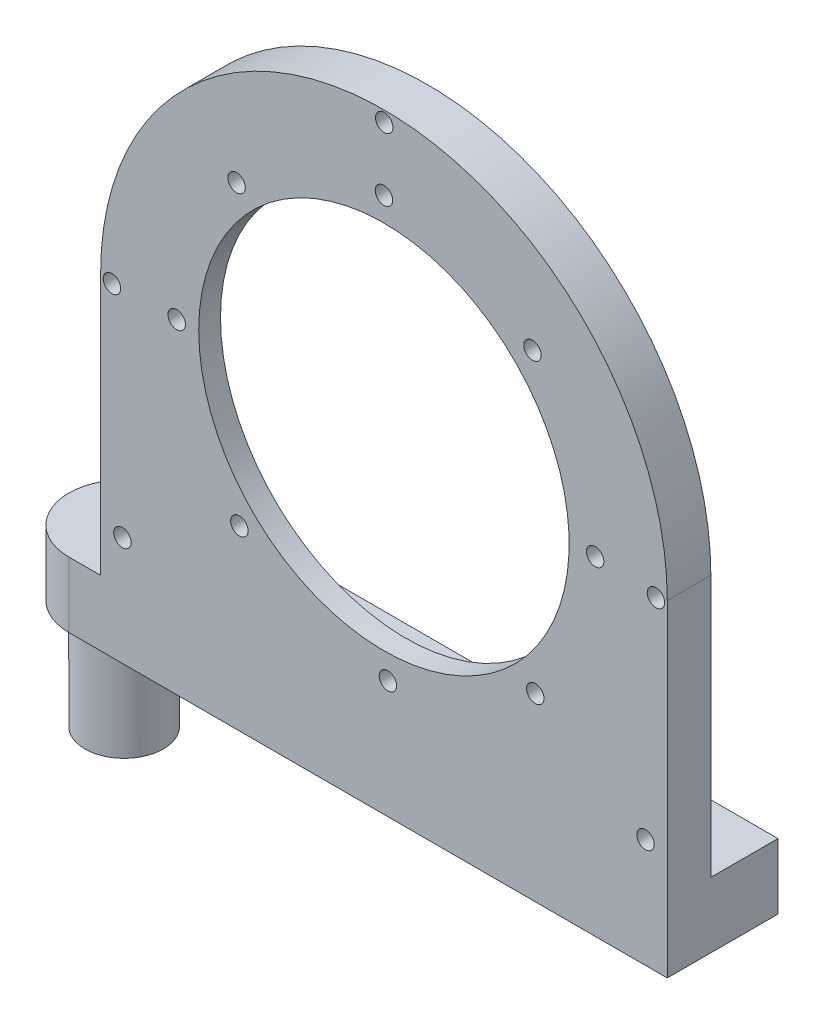
ISO-10303-21;
HEADER;
FILE_DESCRIPTION(('STEP AP214'),'2;1');
FILE_NAME('part.step','',(''),(''),'','','');
FILE_SCHEMA(('AUTOMOTIVE_DESIGN { 1 0 10303 214 1 1 1 1 }'));
ENDSEC;
DATA;
#1=APPLICATION_CONTEXT('core data for automotive mechanical design processes');
#2=APPLICATION_PROTOCOL_DEFINITION('international standard','automotive_design',2000,#1);
#3=PRODUCT_CONTEXT('',#1,'mechanical');
#4=PRODUCT('Part','Part','',(#3));
#5=PRODUCT_RELATED_PRODUCT_CATEGORY('part','',(#4));
#6=PRODUCT_DEFINITION_FORMATION('','',#4);
#7=PRODUCT_DEFINITION_CONTEXT('part definition',#1,'design');
#8=PRODUCT_DEFINITION('design','',#6,#7);
#9=PRODUCT_DEFINITION_SHAPE('','',#8);
#10=(LENGTH_UNIT() NAMED_UNIT(*) SI_UNIT(.MILLI.,.METRE.));
#11=(NAMED_UNIT(*) PLANE_ANGLE_UNIT() SI_UNIT($,.RADIAN.));
#12=(NAMED_UNIT(*) SI_UNIT($,.STERADIAN.) SOLID_ANGLE_UNIT());
#13=UNCERTAINTY_MEASURE_WITH_UNIT(LENGTH_MEASURE(1.E-05),#10,'distance_accuracy_value','');
#14=(GEOMETRIC_REPRESENTATION_CONTEXT(3) GLOBAL_UNCERTAINTY_ASSIGNED_CONTEXT((#13)) GLOBAL_UNIT_ASSIGNED_CONTEXT((#10,
#11,#12)) REPRESENTATION_CONTEXT('',''));
#15=CARTESIAN_POINT('',(0.,0.,0.));
#16=DIRECTION('',(0.,0.,1.));
#17=DIRECTION('',(1.,0.,0.));
#18=AXIS2_PLACEMENT_3D('',#15,#16,#17);
#19=CARTESIAN_POINT('',(-35.455305466238,140.,-17.2327974276527));
#20=DIRECTION('',(1.,0.,0.));
#21=DIRECTION('',(0.,0.,-1.));
#22=AXIS2_PLACEMENT_3D('',#19,#20,#21);
#23=PLANE('',#22);
#24=DIRECTION('',(0.,1.,0.));
#25=VECTOR('',#24,1.);
#26=CARTESIAN_POINT('',(-35.455305466238,15.,-1.83279742765273));
#27=LINE('',#26,#25);
#28=CARTESIAN_POINT('',(-35.455305466238,15.,-1.83279742765273));
#29=VERTEX_POINT('',#28);
#30=CARTESIAN_POINT('',(-35.455305466238,75.,-1.83279742765274));
#31=VERTEX_POINT('',#30);
#32=EDGE_CURVE('E82',#29,#31,#27,.T.);
#33=ORIENTED_EDGE('',*,*,#32,.F.);
#34=DIRECTION('',(0.,0.,1.));
#35=VECTOR('',#34,1.);
#36=CARTESIAN_POINT('',(-35.455305466238,15.,-17.2327974276527));
#37=LINE('',#36,#35);
#38=CARTESIAN_POINT('',(-35.455305466238,15.,8.16720257234727));
#39=VERTEX_POINT('',#38);
#40=EDGE_CURVE('E150',#29,#39,#37,.T.);
#41=ORIENTED_EDGE('',*,*,#40,.T.);
#42=DIRECTION('',(0.,-1.,0.));
#43=VECTOR('',#42,1.);
#44=CARTESIAN_POINT('',(-35.455305466238,140.,8.16720257234727));
#45=LINE('',#44,#43);
#46=CARTESIAN_POINT('',(-35.455305466238,75.,8.16720257234726));
#47=VERTEX_POINT('',#46);
#48=EDGE_CURVE('E157',#47,#39,#45,.T.);
#49=ORIENTED_EDGE('',*,*,#48,.F.);
#50=DIRECTION('',(0.,0.,-1.));
#51=VECTOR('',#50,1.);
#52=CARTESIAN_POINT('',(-35.455305466238,75.,132.767202572347));
#53=LINE('',#52,#51);
#54=EDGE_CURVE('E146',#47,#31,#53,.T.);
#55=ORIENTED_EDGE('',*,*,#54,.T.);
#56=EDGE_LOOP('',(#33,#41,#49,#55));
#57=FACE_BOUND('',#56,.T.);
#58=ADVANCED_FACE('F61',(#57),#23,.F.);
#59=CARTESIAN_POINT('',(29.544694533762,75.,132.767202572347));
#60=DIRECTION('',(0.,0.,-1.));
#61=DIRECTION('',(-1.,0.,0.));
#62=AXIS2_PLACEMENT_3D('',#59,#60,#61);
#63=CYLINDRICAL_SURFACE('',#62,65.);
#64=DIRECTION('',(0.,0.,-1.));
#65=VECTOR('',#64,1.);
#66=CARTESIAN_POINT('',(94.544694533762,75.,132.767202572347));
#67=LINE('',#66,#65);
#68=CARTESIAN_POINT('',(94.544694533762,75.,8.16720257234726));
#69=VERTEX_POINT('',#68);
#70=CARTESIAN_POINT('',(94.544694533762,74.9999999999996,-1.83279742765273));
#71=VERTEX_POINT('',#70);
#72=EDGE_CURVE('E136',#69,#71,#67,.T.);
#73=ORIENTED_EDGE('',*,*,#72,.T.);
#74=CARTESIAN_POINT('',(29.544694533762,75.,-1.83279742765273));
#75=DIRECTION('',(0.,0.,-1.));
#76=DIRECTION('',(-1.,0.,0.));
#77=AXIS2_PLACEMENT_3D('',#74,#75,#76);
#78=CIRCLE('',#77,65.);
#79=EDGE_CURVE('E120',#31,#71,#78,.T.);
#80=ORIENTED_EDGE('',*,*,#79,.F.);
#81=ORIENTED_EDGE('',*,*,#54,.F.);
#82=CARTESIAN_POINT('',(29.544694533762,75.,8.16720257234726));
#83=DIRECTION('',(0.,0.,-1.));
#84=DIRECTION('',(-1.,0.,0.));
#85=AXIS2_PLACEMENT_3D('',#82,#83,#84);
#86=CIRCLE('',#85,65.);
#87=EDGE_CURVE('E144',#47,#69,#86,.T.);
#88=ORIENTED_EDGE('',*,*,#87,.T.);
#89=EDGE_LOOP('',(#73,#80,#81,#88));
#90=FACE_BOUND('',#89,.T.);
#91=ADVANCED_FACE('F143',(#90),#63,.T.);
#92=CARTESIAN_POINT('',(-42.7553054662379,15.,-17.2327974276527));
#93=DIRECTION('',(0.,0.,1.));
#94=DIRECTION('',(1.,0.,0.));
#95=AXIS2_PLACEMENT_3D('',#92,#93,#94);
#96=PLANE('',#95);
#97=DIRECTION('',(-1.,0.,0.));
#98=VECTOR('',#97,1.);
#99=CARTESIAN_POINT('',(-42.7553054662379,15.,-17.2327974276527));
#100=LINE('',#99,#98);
#101=CARTESIAN_POINT('',(94.544694533762,15.,-17.2327974276527));
#102=VERTEX_POINT('',#101);
#103=CARTESIAN_POINT('',(-42.7553054662379,15.,-17.2327974276527));
#104=VERTEX_POINT('',#103);
#105=EDGE_CURVE('E166',#102,#104,#100,.T.);
#106=ORIENTED_EDGE('',*,*,#105,.F.);
#107=DIRECTION('',(0.,-1.,0.));
#108=VECTOR('',#107,1.);
#109=CARTESIAN_POINT('',(94.544694533762,15.,-17.2327974276527));
#110=LINE('',#109,#108);
#111=CARTESIAN_POINT('',(94.544694533762,0.,-17.2327974276527));
#112=VERTEX_POINT('',#111);
#113=EDGE_CURVE('E70',#102,#112,#110,.T.);
#114=ORIENTED_EDGE('',*,*,#113,.T.);
#115=DIRECTION('',(-1.,0.,0.));
#116=VECTOR('',#115,1.);
#117=CARTESIAN_POINT('',(-42.7553054662379,0.,-17.2327974276527));
#118=LINE('',#117,#116);
#119=CARTESIAN_POINT('',(-42.7553054662379,0.,-17.2327974276527));
#120=VERTEX_POINT('',#119);
#121=EDGE_CURVE('E181',#112,#120,#118,.T.);
#122=ORIENTED_EDGE('',*,*,#121,.T.);
#123=DIRECTION('',(0.,-1.,0.));
#124=VECTOR('',#123,1.);
#125=CARTESIAN_POINT('',(-42.7553054662379,15.,-17.2327974276527));
#126=LINE('',#125,#124);
#127=EDGE_CURVE('E196',#104,#120,#126,.T.);
#128=ORIENTED_EDGE('',*,*,#127,.F.);
#129=EDGE_LOOP('',(#106,#114,#122,#128));
#130=FACE_BOUND('',#129,.T.);
#131=ADVANCED_FACE('F202',(#130),#96,.F.);
#132=CARTESIAN_POINT('',(-42.7553054662379,15.,8.16720257234727));
#133=DIRECTION('',(0.,0.,-1.));
#134=DIRECTION('',(-1.,0.,0.));
#135=AXIS2_PLACEMENT_3D('',#132,#133,#134);
#136=PLANE('',#135);
#137=CARTESIAN_POINT('',(29.6072688315117,137.49996867565,8.16720257234727));
#138=DIRECTION('',(0.,0.,-1.));
#139=DIRECTION('',(-1.,0.,0.));
#140=AXIS2_PLACEMENT_3D('',#137,#138,#139);
#141=CIRCLE('',#140,2.00000000000001);
#142=CARTESIAN_POINT('',(27.6072688315117,137.49996867565,8.16720257234727));
#143=VERTEX_POINT('',#142);
#144=EDGE_CURVE('E327',#143,#143,#141,.T.);
#145=ORIENTED_EDGE('',*,*,#144,.T.);
#146=EDGE_LOOP('',(#145));
#147=FACE_BOUND('',#146,.T.);
#148=CARTESIAN_POINT('',(91.944694533762,74.2697306362016,8.16720257234727));
#149=DIRECTION('',(0.,0.,-1.));
#150=DIRECTION('',(-1.,0.,0.));
#151=AXIS2_PLACEMENT_3D('',#148,#149,#150);
#152=CIRCLE('',#151,2.);
#153=CARTESIAN_POINT('',(89.944694533762,74.2697306362016,8.16720257234727));
#154=VERTEX_POINT('',#153);
#155=EDGE_CURVE('E311',#154,#154,#152,.T.);
#156=ORIENTED_EDGE('',*,*,#155,.T.);
#157=EDGE_LOOP('',(#156));
#158=FACE_BOUND('',#157,.T.);
#159=CARTESIAN_POINT('',(-32.855305466238,74.2697306362016,8.16720257234727));
#160=DIRECTION('',(0.,0.,-1.));
#161=DIRECTION('',(-1.,0.,0.));
#162=AXIS2_PLACEMENT_3D('',#159,#160,#161);
#163=CIRCLE('',#162,2.);
#164=CARTESIAN_POINT('',(-34.8553054662379,74.2697306362016,8.16720257234727));
#165=VERTEX_POINT('',#164);
#166=EDGE_CURVE('E322',#165,#165,#163,.T.);
#167=ORIENTED_EDGE('',*,*,#166,.T.);
#168=EDGE_LOOP('',(#167));
#169=FACE_BOUND('',#168,.T.);
#170=CARTESIAN_POINT('',(89.544694533762,25.,8.16720257234727));
#171=DIRECTION('',(0.,0.,-1.));
#172=DIRECTION('',(-1.,0.,0.));
#173=AXIS2_PLACEMENT_3D('',#170,#171,#172);
#174=CIRCLE('',#173,2.);
#175=CARTESIAN_POINT('',(87.544694533762,25.,8.16720257234727));
#176=VERTEX_POINT('',#175);
#177=EDGE_CURVE('E279',#176,#176,#174,.T.);
#178=ORIENTED_EDGE('',*,*,#177,.T.);
#179=EDGE_LOOP('',(#178));
#180=FACE_BOUND('',#179,.T.);
#181=CARTESIAN_POINT('',(-30.455305466238,25.,8.16720257234727));
#182=DIRECTION('',(0.,0.,-1.));
#183=DIRECTION('',(-1.,0.,0.));
#184=AXIS2_PLACEMENT_3D('',#181,#182,#183);
#185=CIRCLE('',#184,2.);
#186=CARTESIAN_POINT('',(-32.4553054662379,25.,8.16720257234727));
#187=VERTEX_POINT('',#186);
#188=EDGE_CURVE('E306',#187,#187,#185,.T.);
#189=ORIENTED_EDGE('',*,*,#188,.T.);
#190=EDGE_LOOP('',(#189));
#191=FACE_BOUND('',#190,.T.);
#192=CARTESIAN_POINT('',(29.544694533762,123.,8.16720257234727));
#193=DIRECTION('',(0.,0.,-1.));
#194=DIRECTION('',(-1.,0.,0.));
#195=AXIS2_PLACEMENT_3D('',#192,#193,#194);
#196=CIRCLE('',#195,2.);
#197=CARTESIAN_POINT('',(27.544694533762,123.,8.16720257234727));
#198=VERTEX_POINT('',#197);
#199=EDGE_CURVE('E238',#198,#198,#196,.T.);
#200=ORIENTED_EDGE('',*,*,#199,.T.);
#201=EDGE_LOOP('',(#200));
#202=FACE_BOUND('',#201,.T.);
#203=CARTESIAN_POINT('',(-4.26307507964942,108.619175914283,8.16720257234727));
#204=DIRECTION('',(0.,0.,-1.));
#205=DIRECTION('',(-1.,0.,0.));
#206=AXIS2_PLACEMENT_3D('',#203,#204,#205);
#207=CIRCLE('',#206,1.99999999999999);
#208=CARTESIAN_POINT('',(-6.26307507964941,108.619175914283,8.16720257234727));
#209=VERTEX_POINT('',#208);
#210=EDGE_CURVE('E245',#209,#209,#207,.T.);
#211=ORIENTED_EDGE('',*,*,#210,.T.);
#212=EDGE_LOOP('',(#211));
#213=FACE_BOUND('',#212,.T.);
#214=CARTESIAN_POINT('',(-18.0000000000236,74.5446945337855,8.16720257234727));
#215=DIRECTION('',(0.,0.,-1.));
#216=DIRECTION('',(-1.,0.,0.));
#217=AXIS2_PLACEMENT_3D('',#214,#215,#216);
#218=CIRCLE('',#217,2.);
#219=CARTESIAN_POINT('',(-20.0000000000236,74.5446945337855,8.16720257234727));
#220=VERTEX_POINT('',#219);
#221=EDGE_CURVE('E249',#220,#220,#218,.T.);
#222=ORIENTED_EDGE('',*,*,#221,.T.);
#223=EDGE_LOOP('',(#222));
#224=FACE_BOUND('',#223,.T.);
#225=CARTESIAN_POINT('',(-3.61917591430626,40.7369249203741,8.16720257234727));
#226=DIRECTION('',(0.,0.,-1.));
#227=DIRECTION('',(-1.,0.,0.));
#228=AXIS2_PLACEMENT_3D('',#225,#226,#227);
#229=CIRCLE('',#228,2.00000000000001);
#230=CARTESIAN_POINT('',(-5.61917591430627,40.7369249203741,8.16720257234727));
#231=VERTEX_POINT('',#230);
#232=EDGE_CURVE('E253',#231,#231,#229,.T.);
#233=ORIENTED_EDGE('',*,*,#232,.T.);
#234=EDGE_LOOP('',(#233));
#235=FACE_BOUND('',#234,.T.);
#236=CARTESIAN_POINT('',(30.4553054661911,26.9999999999999,8.16720257234727));
#237=DIRECTION('',(0.,0.,-1.));
#238=DIRECTION('',(-1.,0.,0.));
#239=AXIS2_PLACEMENT_3D('',#236,#237,#238);
#240=CIRCLE('',#239,2.00000000000001);
#241=CARTESIAN_POINT('',(28.4553054661911,26.9999999999999,8.16720257234727));
#242=VERTEX_POINT('',#241);
#243=EDGE_CURVE('E257',#242,#242,#240,.T.);
#244=ORIENTED_EDGE('',*,*,#243,.T.);
#245=EDGE_LOOP('',(#244));
#246=FACE_BOUND('',#245,.T.);
#247=CARTESIAN_POINT('',(64.2630750796024,41.3808240857174,8.16720257234727));
#248=DIRECTION('',(0.,0.,-1.));
#249=DIRECTION('',(-1.,0.,0.));
#250=AXIS2_PLACEMENT_3D('',#247,#248,#249);
#251=CIRCLE('',#250,2.);
#252=CARTESIAN_POINT('',(62.2630750796024,41.3808240857174,8.16720257234727));
#253=VERTEX_POINT('',#252);
#254=EDGE_CURVE('E261',#253,#253,#251,.T.);
#255=ORIENTED_EDGE('',*,*,#254,.T.);
#256=EDGE_LOOP('',(#255));
#257=FACE_BOUND('',#256,.T.);
#258=CARTESIAN_POINT('',(77.9999999999764,75.4553054662148,8.16720257234727));
#259=DIRECTION('',(0.,0.,-1.));
#260=DIRECTION('',(-1.,0.,0.));
#261=AXIS2_PLACEMENT_3D('',#258,#259,#260);
#262=CIRCLE('',#261,2.);
#263=CARTESIAN_POINT('',(75.9999999999764,75.4553054662148,8.16720257234727));
#264=VERTEX_POINT('',#263);
#265=EDGE_CURVE('E265',#264,#264,#262,.T.);
#266=ORIENTED_EDGE('',*,*,#265,.T.);
#267=EDGE_LOOP('',(#266));
#268=FACE_BOUND('',#267,.T.);
#269=CARTESIAN_POINT('',(63.6191759142588,109.263075079626,8.16720257234727));
#270=DIRECTION('',(0.,0.,-1.));
#271=DIRECTION('',(-1.,0.,0.));
#272=AXIS2_PLACEMENT_3D('',#269,#270,#271);
#273=CIRCLE('',#272,2.);
#274=CARTESIAN_POINT('',(61.6191759142588,109.263075079626,8.16720257234727));
#275=VERTEX_POINT('',#274);
#276=EDGE_CURVE('E269',#275,#275,#273,.T.);
#277=ORIENTED_EDGE('',*,*,#276,.T.);
#278=EDGE_LOOP('',(#277));
#279=FACE_BOUND('',#278,.T.);
#280=CARTESIAN_POINT('',(29.544694533762,75.,8.16720257234727));
#281=DIRECTION('',(0.,0.,-1.));
#282=DIRECTION('',(-1.,0.,0.));
#283=AXIS2_PLACEMENT_3D('',#280,#281,#282);
#284=CIRCLE('',#283,42.5);
#285=CARTESIAN_POINT('',(-12.955305466238,75.,8.16720257234727));
#286=VERTEX_POINT('',#285);
#287=EDGE_CURVE('E230',#286,#286,#284,.T.);
#288=ORIENTED_EDGE('',*,*,#287,.T.);
#289=EDGE_LOOP('',(#288));
#290=FACE_BOUND('',#289,.T.);
#291=ORIENTED_EDGE('',*,*,#87,.F.);
#292=ORIENTED_EDGE('',*,*,#48,.T.);
#293=DIRECTION('',(1.,0.,0.));
#294=VECTOR('',#293,1.);
#295=CARTESIAN_POINT('',(-42.7553054662379,15.,8.16720257234727));
#296=LINE('',#295,#294);
#297=CARTESIAN_POINT('',(-42.7553054662379,15.,8.16720257234727));
#298=VERTEX_POINT('',#297);
#299=EDGE_CURVE('E173',#298,#39,#296,.T.);
#300=ORIENTED_EDGE('',*,*,#299,.F.);
#301=DIRECTION('',(0.,-1.,0.));
#302=VECTOR('',#301,1.);
#303=CARTESIAN_POINT('',(-42.7553054662379,15.,8.16720257234727));
#304=LINE('',#303,#302);
#305=CARTESIAN_POINT('',(-42.7553054662379,0.,8.16720257234727));
#306=VERTEX_POINT('',#305);
#307=EDGE_CURVE('E192',#298,#306,#304,.T.);
#308=ORIENTED_EDGE('',*,*,#307,.T.);
#309=DIRECTION('',(1.,0.,0.));
#310=VECTOR('',#309,1.);
#311=CARTESIAN_POINT('',(-42.7553054662379,0.,8.16720257234727));
#312=LINE('',#311,#310);
#313=CARTESIAN_POINT('',(94.544694533762,0.,8.16720257234727));
#314=VERTEX_POINT('',#313);
#315=EDGE_CURVE('E170',#306,#314,#312,.T.);
#316=ORIENTED_EDGE('',*,*,#315,.T.);
#317=DIRECTION('',(0.,-1.,0.));
#318=VECTOR('',#317,1.);
#319=CARTESIAN_POINT('',(94.544694533762,15.,8.16720257234727));
#320=LINE('',#319,#318);
#321=EDGE_CURVE('E177',#69,#314,#320,.T.);
#322=ORIENTED_EDGE('',*,*,#321,.F.);
#323=EDGE_LOOP('',(#291,#292,#300,#308,#316,#322));
#324=FACE_BOUND('',#323,.T.);
#325=ADVANCED_FACE('F210',(#147,#158,#169,#180,#191,#202,#213,#224,#235,#246,#257,#268,#279,
#290,#324),#136,.F.);
#326=CARTESIAN_POINT('',(94.544694533762,15.,-17.2327974276527));
#327=DIRECTION('',(-1.,0.,0.));
#328=DIRECTION('',(0.,0.,1.));
#329=AXIS2_PLACEMENT_3D('',#326,#327,#328);
#330=PLANE('',#329);
#331=ORIENTED_EDGE('',*,*,#113,.F.);
#332=DIRECTION('',(0.,0.,-1.));
#333=VECTOR('',#332,1.);
#334=CARTESIAN_POINT('',(94.544694533762,15.,-1.83279742765273));
#335=LINE('',#334,#333);
#336=CARTESIAN_POINT('',(94.544694533762,15.,-1.83279742765273));
#337=VERTEX_POINT('',#336);
#338=EDGE_CURVE('E139',#337,#102,#335,.T.);
#339=ORIENTED_EDGE('',*,*,#338,.F.);
#340=DIRECTION('',(0.,-1.,0.));
#341=VECTOR('',#340,1.);
#342=CARTESIAN_POINT('',(94.544694533762,15.,-1.83279742765273));
#343=LINE('',#342,#341);
#344=EDGE_CURVE('E124',#71,#337,#343,.T.);
#345=ORIENTED_EDGE('',*,*,#344,.F.);
#346=ORIENTED_EDGE('',*,*,#72,.F.);
#347=ORIENTED_EDGE('',*,*,#321,.T.);
#348=DIRECTION('',(0.,0.,-1.));
#349=VECTOR('',#348,1.);
#350=CARTESIAN_POINT('',(94.544694533762,0.,-17.2327974276527));
#351=LINE('',#350,#349);
#352=EDGE_CURVE('E165',#314,#112,#351,.T.);
#353=ORIENTED_EDGE('',*,*,#352,.T.);
#354=EDGE_LOOP('',(#331,#339,#345,#346,#347,#353));
#355=FACE_BOUND('',#354,.T.);
#356=ADVANCED_FACE('F63',(#355),#330,.F.);
#357=CARTESIAN_POINT('',(-42.7553054662379,15.,-4.53279742765273));
#358=DIRECTION('',(0.,-1.,0.));
#359=DIRECTION('',(0.,0.,-1.));
#360=AXIS2_PLACEMENT_3D('',#357,#358,#359);
#361=CYLINDRICAL_SURFACE('',#360,12.7);
#362=CARTESIAN_POINT('',(-42.7553054662379,0.,-4.53279742765273));
#363=DIRECTION('',(0.,1.,0.));
#364=DIRECTION('',(0.,0.,1.));
#365=AXIS2_PLACEMENT_3D('',#362,#363,#364);
#366=CIRCLE('',#365,12.7);
#367=EDGE_CURVE('E184',#120,#306,#366,.T.);
#368=ORIENTED_EDGE('',*,*,#367,.T.);
#369=ORIENTED_EDGE('',*,*,#307,.F.);
#370=CARTESIAN_POINT('',(-42.7553054662379,15.,-4.53279742765273));
#371=DIRECTION('',(0.,1.,0.));
#372=DIRECTION('',(0.,0.,1.));
#373=AXIS2_PLACEMENT_3D('',#370,#371,#372);
#374=CIRCLE('',#373,12.7);
#375=EDGE_CURVE('E169',#104,#298,#374,.T.);
#376=ORIENTED_EDGE('',*,*,#375,.F.);
#377=ORIENTED_EDGE('',*,*,#127,.T.);
#378=EDGE_LOOP('',(#368,#369,#376,#377));
#379=FACE_BOUND('',#378,.T.);
#380=ADVANCED_FACE('F215',(#379),#361,.T.);
#381=CARTESIAN_POINT('',(-42.7553054662379,15.,-4.53279742765273));
#382=DIRECTION('',(0.,1.,0.));
#383=DIRECTION('',(0.,0.,1.));
#384=AXIS2_PLACEMENT_3D('',#381,#382,#383);
#385=PLANE('',#384);
#386=ORIENTED_EDGE('',*,*,#40,.F.);
#387=DIRECTION('',(-1.,0.,0.));
#388=VECTOR('',#387,1.);
#389=CARTESIAN_POINT('',(-35.455305466238,15.,-1.83279742765273));
#390=LINE('',#389,#388);
#391=CARTESIAN_POINT('',(29.544694533762,15.,-1.83279742765273));
#392=VERTEX_POINT('',#391);
#393=EDGE_CURVE('E141',#392,#29,#390,.T.);
#394=ORIENTED_EDGE('',*,*,#393,.F.);
#395=EDGE_CURVE('E220',#337,#392,#390,.T.);
#396=ORIENTED_EDGE('',*,*,#395,.F.);
#397=ORIENTED_EDGE('',*,*,#338,.T.);
#398=ORIENTED_EDGE('',*,*,#105,.T.);
#399=ORIENTED_EDGE('',*,*,#375,.T.);
#400=ORIENTED_EDGE('',*,*,#299,.T.);
#401=EDGE_LOOP('',(#386,#394,#396,#397,#398,#399,#400));
#402=FACE_BOUND('',#401,.T.);
#403=ADVANCED_FACE('F218',(#402),#385,.T.);
#404=CARTESIAN_POINT('',(-42.7553054662379,0.,-4.53279742765273));
#405=DIRECTION('',(0.,1.,0.));
#406=DIRECTION('',(0.,0.,1.));
#407=AXIS2_PLACEMENT_3D('',#404,#405,#406);
#408=PLANE('',#407);
#409=CARTESIAN_POINT('',(-42.7553054662379,0.,-4.53279742765273));
#410=DIRECTION('',(0.,1.,0.));
#411=DIRECTION('',(0.,0.,1.));
#412=AXIS2_PLACEMENT_3D('',#409,#410,#411);
#413=CIRCLE('',#412,9.);
#414=CARTESIAN_POINT('',(-42.7553054662379,0.,4.46720257234727));
#415=VERTEX_POINT('',#414);
#416=EDGE_CURVE('E12',#415,#415,#413,.F.);
#417=ORIENTED_EDGE('',*,*,#416,.F.);
#418=EDGE_LOOP('',(#417));
#419=FACE_BOUND('',#418,.T.);
#420=ORIENTED_EDGE('',*,*,#352,.F.);
#421=ORIENTED_EDGE('',*,*,#315,.F.);
#422=ORIENTED_EDGE('',*,*,#367,.F.);
#423=ORIENTED_EDGE('',*,*,#121,.F.);
#424=EDGE_LOOP('',(#420,#421,#422,#423));
#425=FACE_BOUND('',#424,.T.);
#426=ADVANCED_FACE('F207',(#419,#425),#408,.F.);
#427=CARTESIAN_POINT('',(-42.7553054662379,-25.,-4.53279742765273));
#428=DIRECTION('',(0.,1.,0.));
#429=DIRECTION('',(0.,0.,1.));
#430=AXIS2_PLACEMENT_3D('',#427,#428,#429);
#431=CYLINDRICAL_SURFACE('',#430,9.);
#432=CARTESIAN_POINT('',(-42.7553054662379,-25.,-4.53279742765273));
#433=DIRECTION('',(0.,-1.,0.));
#434=DIRECTION('',(0.,0.,-1.));
#435=AXIS2_PLACEMENT_3D('',#432,#433,#434);
#436=CIRCLE('',#435,9.);
#437=CARTESIAN_POINT('',(-42.7553054662379,-25.,-13.5327974276527));
#438=VERTEX_POINT('',#437);
#439=EDGE_CURVE('E161',#438,#438,#436,.T.);
#440=ORIENTED_EDGE('',*,*,#439,.F.);
#441=EDGE_LOOP('',(#440));
#442=FACE_BOUND('',#441,.T.);
#443=ORIENTED_EDGE('',*,*,#416,.T.);
#444=EDGE_LOOP('',(#443));
#445=FACE_BOUND('',#444,.T.);
#446=ADVANCED_FACE('F395',(#442,#445),#431,.T.);
#447=CARTESIAN_POINT('',(-42.7553054662379,-25.,-4.53279742765273));
#448=DIRECTION('',(0.,-1.,0.));
#449=DIRECTION('',(0.,0.,-1.));
#450=AXIS2_PLACEMENT_3D('',#447,#448,#449);
#451=PLANE('',#450);
#452=ORIENTED_EDGE('',*,*,#439,.T.);
#453=EDGE_LOOP('',(#452));
#454=FACE_BOUND('',#453,.T.);
#455=ADVANCED_FACE('F358',(#454),#451,.T.);
#456=CARTESIAN_POINT('',(29.544694533762,75.,-1.83279742765273));
#457=DIRECTION('',(0.,0.,-1.));
#458=DIRECTION('',(-1.,0.,0.));
#459=AXIS2_PLACEMENT_3D('',#456,#457,#458);
#460=PLANE('',#459);
#461=CARTESIAN_POINT('',(29.6072688315117,137.49996867565,-1.83279742765273));
#462=DIRECTION('',(0.,0.,-1.));
#463=DIRECTION('',(-1.,0.,0.));
#464=AXIS2_PLACEMENT_3D('',#461,#462,#463);
#465=CIRCLE('',#464,2.00000000000001);
#466=CARTESIAN_POINT('',(27.6072688315117,137.49996867565,-1.83279742765273));
#467=VERTEX_POINT('',#466);
#468=EDGE_CURVE('E338',#467,#467,#465,.T.);
#469=ORIENTED_EDGE('',*,*,#468,.F.);
#470=EDGE_LOOP('',(#469));
#471=FACE_BOUND('',#470,.T.);
#472=CARTESIAN_POINT('',(91.944694533762,74.2697306362016,-1.83279742765273));
#473=DIRECTION('',(0.,0.,-1.));
#474=DIRECTION('',(-1.,0.,0.));
#475=AXIS2_PLACEMENT_3D('',#472,#473,#474);
#476=CIRCLE('',#475,2.);
#477=CARTESIAN_POINT('',(89.944694533762,74.2697306362016,-1.83279742765273));
#478=VERTEX_POINT('',#477);
#479=EDGE_CURVE('E331',#478,#478,#476,.T.);
#480=ORIENTED_EDGE('',*,*,#479,.F.);
#481=EDGE_LOOP('',(#480));
#482=FACE_BOUND('',#481,.T.);
#483=CARTESIAN_POINT('',(-32.855305466238,74.2697306362016,-1.83279742765273));
#484=DIRECTION('',(0.,0.,-1.));
#485=DIRECTION('',(-1.,0.,0.));
#486=AXIS2_PLACEMENT_3D('',#483,#484,#485);
#487=CIRCLE('',#486,2.);
#488=CARTESIAN_POINT('',(-34.8553054662379,74.2697306362016,-1.83279742765273));
#489=VERTEX_POINT('',#488);
#490=EDGE_CURVE('E326',#489,#489,#487,.T.);
#491=ORIENTED_EDGE('',*,*,#490,.F.);
#492=EDGE_LOOP('',(#491));
#493=FACE_BOUND('',#492,.T.);
#494=CARTESIAN_POINT('',(89.544694533762,25.,-1.83279742765273));
#495=DIRECTION('',(0.,0.,-1.));
#496=DIRECTION('',(-1.,0.,0.));
#497=AXIS2_PLACEMENT_3D('',#494,#495,#496);
#498=CIRCLE('',#497,2.);
#499=CARTESIAN_POINT('',(87.544694533762,25.,-1.83279742765273));
#500=VERTEX_POINT('',#499);
#501=EDGE_CURVE('E315',#500,#500,#498,.T.);
#502=ORIENTED_EDGE('',*,*,#501,.F.);
#503=EDGE_LOOP('',(#502));
#504=FACE_BOUND('',#503,.T.);
#505=CARTESIAN_POINT('',(-30.455305466238,25.,-1.83279742765273));
#506=DIRECTION('',(0.,0.,-1.));
#507=DIRECTION('',(-1.,0.,0.));
#508=AXIS2_PLACEMENT_3D('',#505,#506,#507);
#509=CIRCLE('',#508,2.);
#510=CARTESIAN_POINT('',(-32.4553054662379,25.,-1.83279742765273));
#511=VERTEX_POINT('',#510);
#512=EDGE_CURVE('E310',#511,#511,#509,.T.);
#513=ORIENTED_EDGE('',*,*,#512,.F.);
#514=EDGE_LOOP('',(#513));
#515=FACE_BOUND('',#514,.T.);
#516=ORIENTED_EDGE('',*,*,#395,.T.);
#517=CARTESIAN_POINT('',(29.544694533762,75.,-1.83279742765273));
#518=DIRECTION('',(0.,0.,-1.));
#519=DIRECTION('',(-1.,0.,0.));
#520=AXIS2_PLACEMENT_3D('',#517,#518,#519);
#521=CIRCLE('',#520,60.);
#522=EDGE_CURVE('E75',#392,#392,#521,.T.);
#523=ORIENTED_EDGE('',*,*,#522,.F.);
#524=ORIENTED_EDGE('',*,*,#393,.T.);
#525=ORIENTED_EDGE('',*,*,#32,.T.);
#526=ORIENTED_EDGE('',*,*,#79,.T.);
#527=ORIENTED_EDGE('',*,*,#344,.T.);
#528=EDGE_LOOP('',(#516,#523,#524,#525,#526,#527));
#529=FACE_BOUND('',#528,.T.);
#530=ADVANCED_FACE('F123',(#471,#482,#493,#504,#515,#529),#460,.T.);
#531=CARTESIAN_POINT('',(29.544694533762,75.,3.16720257234727));
#532=DIRECTION('',(0.,0.,-1.));
#533=DIRECTION('',(-1.,0.,0.));
#534=AXIS2_PLACEMENT_3D('',#531,#532,#533);
#535=CYLINDRICAL_SURFACE('',#534,60.);
#536=CARTESIAN_POINT('',(29.544694533762,75.,3.16720257234727));
#537=DIRECTION('',(0.,0.,-1.));
#538=DIRECTION('',(-1.,0.,0.));
#539=AXIS2_PLACEMENT_3D('',#536,#537,#538);
#540=CIRCLE('',#539,60.);
#541=CARTESIAN_POINT('',(-30.455305466238,75.,3.16720257234727));
#542=VERTEX_POINT('',#541);
#543=EDGE_CURVE('E227',#542,#542,#540,.T.);
#544=ORIENTED_EDGE('',*,*,#543,.F.);
#545=EDGE_LOOP('',(#544));
#546=FACE_BOUND('',#545,.T.);
#547=ORIENTED_EDGE('',*,*,#522,.T.);
#548=EDGE_LOOP('',(#547));
#549=FACE_BOUND('',#548,.T.);
#550=ADVANCED_FACE('F357',(#546,#549),#535,.F.);
#551=CARTESIAN_POINT('',(29.544694533762,75.,3.16720257234727));
#552=DIRECTION('',(0.,0.,-1.));
#553=DIRECTION('',(-1.,0.,0.));
#554=AXIS2_PLACEMENT_3D('',#551,#552,#553);
#555=PLANE('',#554);
#556=CARTESIAN_POINT('',(29.544694533762,123.,3.16720257234727));
#557=DIRECTION('',(0.,0.,-1.));
#558=DIRECTION('',(-1.,0.,0.));
#559=AXIS2_PLACEMENT_3D('',#556,#557,#558);
#560=CIRCLE('',#559,2.);
#561=CARTESIAN_POINT('',(27.544694533762,123.,3.16720257234727));
#562=VERTEX_POINT('',#561);
#563=EDGE_CURVE('E273',#562,#562,#560,.T.);
#564=ORIENTED_EDGE('',*,*,#563,.F.);
#565=EDGE_LOOP('',(#564));
#566=FACE_BOUND('',#565,.T.);
#567=CARTESIAN_POINT('',(-4.26307507964942,108.619175914283,3.16720257234727));
#568=DIRECTION('',(0.,0.,-1.));
#569=DIRECTION('',(-1.,0.,0.));
#570=AXIS2_PLACEMENT_3D('',#567,#568,#569);
#571=CIRCLE('',#570,1.99999999999999);
#572=CARTESIAN_POINT('',(-6.26307507964941,108.619175914283,3.16720257234727));
#573=VERTEX_POINT('',#572);
#574=EDGE_CURVE('E299',#573,#573,#571,.T.);
#575=ORIENTED_EDGE('',*,*,#574,.F.);
#576=EDGE_LOOP('',(#575));
#577=FACE_BOUND('',#576,.T.);
#578=CARTESIAN_POINT('',(-18.0000000000236,74.5446945337855,3.16720257234727));
#579=DIRECTION('',(0.,0.,-1.));
#580=DIRECTION('',(-1.,0.,0.));
#581=AXIS2_PLACEMENT_3D('',#578,#579,#580);
#582=CIRCLE('',#581,2.);
#583=CARTESIAN_POINT('',(-20.0000000000236,74.5446945337855,3.16720257234727));
#584=VERTEX_POINT('',#583);
#585=EDGE_CURVE('E295',#584,#584,#582,.T.);
#586=ORIENTED_EDGE('',*,*,#585,.F.);
#587=EDGE_LOOP('',(#586));
#588=FACE_BOUND('',#587,.T.);
#589=CARTESIAN_POINT('',(-3.61917591430626,40.7369249203741,3.16720257234727));
#590=DIRECTION('',(0.,0.,-1.));
#591=DIRECTION('',(-1.,0.,0.));
#592=AXIS2_PLACEMENT_3D('',#589,#590,#591);
#593=CIRCLE('',#592,2.00000000000001);
#594=CARTESIAN_POINT('',(-5.61917591430627,40.7369249203741,3.16720257234727));
#595=VERTEX_POINT('',#594);
#596=EDGE_CURVE('E291',#595,#595,#593,.T.);
#597=ORIENTED_EDGE('',*,*,#596,.F.);
#598=EDGE_LOOP('',(#597));
#599=FACE_BOUND('',#598,.T.);
#600=CARTESIAN_POINT('',(30.4553054661911,26.9999999999999,3.16720257234727));
#601=DIRECTION('',(0.,0.,-1.));
#602=DIRECTION('',(-1.,0.,0.));
#603=AXIS2_PLACEMENT_3D('',#600,#601,#602);
#604=CIRCLE('',#603,2.00000000000001);
#605=CARTESIAN_POINT('',(28.4553054661911,26.9999999999999,3.16720257234727));
#606=VERTEX_POINT('',#605);
#607=EDGE_CURVE('E287',#606,#606,#604,.T.);
#608=ORIENTED_EDGE('',*,*,#607,.F.);
#609=EDGE_LOOP('',(#608));
#610=FACE_BOUND('',#609,.T.);
#611=CARTESIAN_POINT('',(64.2630750796024,41.3808240857174,3.16720257234727));
#612=DIRECTION('',(0.,0.,-1.));
#613=DIRECTION('',(-1.,0.,0.));
#614=AXIS2_PLACEMENT_3D('',#611,#612,#613);
#615=CIRCLE('',#614,2.);
#616=CARTESIAN_POINT('',(62.2630750796024,41.3808240857174,3.16720257234727));
#617=VERTEX_POINT('',#616);
#618=EDGE_CURVE('E283',#617,#617,#615,.T.);
#619=ORIENTED_EDGE('',*,*,#618,.F.);
#620=EDGE_LOOP('',(#619));
#621=FACE_BOUND('',#620,.T.);
#622=CARTESIAN_POINT('',(77.9999999999764,75.4553054662148,3.16720257234727));
#623=DIRECTION('',(0.,0.,-1.));
#624=DIRECTION('',(-1.,0.,0.));
#625=AXIS2_PLACEMENT_3D('',#622,#623,#624);
#626=CIRCLE('',#625,2.);
#627=CARTESIAN_POINT('',(75.9999999999764,75.4553054662148,3.16720257234727));
#628=VERTEX_POINT('',#627);
#629=EDGE_CURVE('E278',#628,#628,#626,.T.);
#630=ORIENTED_EDGE('',*,*,#629,.F.);
#631=EDGE_LOOP('',(#630));
#632=FACE_BOUND('',#631,.T.);
#633=CARTESIAN_POINT('',(63.6191759142588,109.263075079626,3.16720257234727));
#634=DIRECTION('',(0.,0.,-1.));
#635=DIRECTION('',(-1.,0.,0.));
#636=AXIS2_PLACEMENT_3D('',#633,#634,#635);
#637=CIRCLE('',#636,2.);
#638=CARTESIAN_POINT('',(61.6191759142588,109.263075079626,3.16720257234727));
#639=VERTEX_POINT('',#638);
#640=EDGE_CURVE('E274',#639,#639,#637,.T.);
#641=ORIENTED_EDGE('',*,*,#640,.F.);
#642=EDGE_LOOP('',(#641));
#643=FACE_BOUND('',#642,.T.);
#644=CARTESIAN_POINT('',(29.544694533762,75.,3.16720257234727));
#645=DIRECTION('',(0.,0.,-1.));
#646=DIRECTION('',(-1.,0.,0.));
#647=AXIS2_PLACEMENT_3D('',#644,#645,#646);
#648=CIRCLE('',#647,42.5);
#649=CARTESIAN_POINT('',(-12.955305466238,75.,3.16720257234727));
#650=VERTEX_POINT('',#649);
#651=EDGE_CURVE('E234',#650,#650,#648,.T.);
#652=ORIENTED_EDGE('',*,*,#651,.F.);
#653=EDGE_LOOP('',(#652));
#654=FACE_BOUND('',#653,.T.);
#655=ORIENTED_EDGE('',*,*,#543,.T.);
#656=EDGE_LOOP('',(#655));
#657=FACE_BOUND('',#656,.T.);
#658=ADVANCED_FACE('F454',(#566,#577,#588,#599,#610,#621,#632,#643,#654,#657),#555,.T.);
#659=CARTESIAN_POINT('',(29.544694533762,75.,8.16720257234727));
#660=DIRECTION('',(0.,0.,-1.));
#661=DIRECTION('',(-1.,0.,0.));
#662=AXIS2_PLACEMENT_3D('',#659,#660,#661);
#663=CYLINDRICAL_SURFACE('',#662,42.5);
#664=ORIENTED_EDGE('',*,*,#287,.F.);
#665=EDGE_LOOP('',(#664));
#666=FACE_BOUND('',#665,.T.);
#667=ORIENTED_EDGE('',*,*,#651,.T.);
#668=EDGE_LOOP('',(#667));
#669=FACE_BOUND('',#668,.T.);
#670=ADVANCED_FACE('F463',(#666,#669),#663,.F.);
#671=CARTESIAN_POINT('',(63.6191759142588,109.263075079626,13.1672025723473));
#672=DIRECTION('',(0.,0.,-1.));
#673=DIRECTION('',(-1.,0.,0.));
#674=AXIS2_PLACEMENT_3D('',#671,#672,#673);
#675=CYLINDRICAL_SURFACE('',#674,2.);
#676=ORIENTED_EDGE('',*,*,#640,.T.);
#677=EDGE_LOOP('',(#676));
#678=FACE_BOUND('',#677,.T.);
#679=ORIENTED_EDGE('',*,*,#276,.F.);
#680=EDGE_LOOP('',(#679));
#681=FACE_BOUND('',#680,.T.);
#682=ADVANCED_FACE('F471',(#678,#681),#675,.F.);
#683=CARTESIAN_POINT('',(77.9999999999764,75.4553054662148,13.1672025723473));
#684=DIRECTION('',(0.,0.,-1.));
#685=DIRECTION('',(-1.,0.,0.));
#686=AXIS2_PLACEMENT_3D('',#683,#684,#685);
#687=CYLINDRICAL_SURFACE('',#686,2.);
#688=ORIENTED_EDGE('',*,*,#629,.T.);
#689=EDGE_LOOP('',(#688));
#690=FACE_BOUND('',#689,.T.);
#691=ORIENTED_EDGE('',*,*,#265,.F.);
#692=EDGE_LOOP('',(#691));
#693=FACE_BOUND('',#692,.T.);
#694=ADVANCED_FACE('F478',(#690,#693),#687,.F.);
#695=CARTESIAN_POINT('',(64.2630750796024,41.3808240857174,13.1672025723473));
#696=DIRECTION('',(0.,0.,-1.));
#697=DIRECTION('',(-1.,0.,0.));
#698=AXIS2_PLACEMENT_3D('',#695,#696,#697);
#699=CYLINDRICAL_SURFACE('',#698,2.);
#700=ORIENTED_EDGE('',*,*,#618,.T.);
#701=EDGE_LOOP('',(#700));
#702=FACE_BOUND('',#701,.T.);
#703=ORIENTED_EDGE('',*,*,#254,.F.);
#704=EDGE_LOOP('',(#703));
#705=FACE_BOUND('',#704,.T.);
#706=ADVANCED_FACE('F486',(#702,#705),#699,.F.);
#707=CARTESIAN_POINT('',(30.4553054661911,26.9999999999999,13.1672025723473));
#708=DIRECTION('',(0.,0.,-1.));
#709=DIRECTION('',(-1.,0.,0.));
#710=AXIS2_PLACEMENT_3D('',#707,#708,#709);
#711=CYLINDRICAL_SURFACE('',#710,2.00000000000001);
#712=ORIENTED_EDGE('',*,*,#607,.T.);
#713=EDGE_LOOP('',(#712));
#714=FACE_BOUND('',#713,.T.);
#715=ORIENTED_EDGE('',*,*,#243,.F.);
#716=EDGE_LOOP('',(#715));
#717=FACE_BOUND('',#716,.T.);
#718=ADVANCED_FACE('F494',(#714,#717),#711,.F.);
#719=CARTESIAN_POINT('',(-3.61917591430626,40.7369249203741,13.1672025723473));
#720=DIRECTION('',(0.,0.,-1.));
#721=DIRECTION('',(-1.,0.,0.));
#722=AXIS2_PLACEMENT_3D('',#719,#720,#721);
#723=CYLINDRICAL_SURFACE('',#722,2.00000000000001);
#724=ORIENTED_EDGE('',*,*,#596,.T.);
#725=EDGE_LOOP('',(#724));
#726=FACE_BOUND('',#725,.T.);
#727=ORIENTED_EDGE('',*,*,#232,.F.);
#728=EDGE_LOOP('',(#727));
#729=FACE_BOUND('',#728,.T.);
#730=ADVANCED_FACE('F502',(#726,#729),#723,.F.);
#731=CARTESIAN_POINT('',(-18.0000000000236,74.5446945337855,13.1672025723473));
#732=DIRECTION('',(0.,0.,-1.));
#733=DIRECTION('',(-1.,0.,0.));
#734=AXIS2_PLACEMENT_3D('',#731,#732,#733);
#735=CYLINDRICAL_SURFACE('',#734,2.);
#736=ORIENTED_EDGE('',*,*,#585,.T.);
#737=EDGE_LOOP('',(#736));
#738=FACE_BOUND('',#737,.T.);
#739=ORIENTED_EDGE('',*,*,#221,.F.);
#740=EDGE_LOOP('',(#739));
#741=FACE_BOUND('',#740,.T.);
#742=ADVANCED_FACE('F510',(#738,#741),#735,.F.);
#743=CARTESIAN_POINT('',(-4.26307507964942,108.619175914283,13.1672025723473));
#744=DIRECTION('',(0.,0.,-1.));
#745=DIRECTION('',(-1.,0.,0.));
#746=AXIS2_PLACEMENT_3D('',#743,#744,#745);
#747=CYLINDRICAL_SURFACE('',#746,1.99999999999999);
#748=ORIENTED_EDGE('',*,*,#574,.T.);
#749=EDGE_LOOP('',(#748));
#750=FACE_BOUND('',#749,.T.);
#751=ORIENTED_EDGE('',*,*,#210,.F.);
#752=EDGE_LOOP('',(#751));
#753=FACE_BOUND('',#752,.T.);
#754=ADVANCED_FACE('F381',(#750,#753),#747,.F.);
#755=CARTESIAN_POINT('',(29.544694533762,123.,13.1672025723473));
#756=DIRECTION('',(0.,0.,-1.));
#757=DIRECTION('',(-1.,0.,0.));
#758=AXIS2_PLACEMENT_3D('',#755,#756,#757);
#759=CYLINDRICAL_SURFACE('',#758,2.);
#760=ORIENTED_EDGE('',*,*,#563,.T.);
#761=EDGE_LOOP('',(#760));
#762=FACE_BOUND('',#761,.T.);
#763=ORIENTED_EDGE('',*,*,#199,.F.);
#764=EDGE_LOOP('',(#763));
#765=FACE_BOUND('',#764,.T.);
#766=ADVANCED_FACE('F371',(#762,#765),#759,.F.);
#767=CARTESIAN_POINT('',(-30.455305466238,25.,8.16720257234727));
#768=DIRECTION('',(0.,0.,-1.));
#769=DIRECTION('',(-1.,0.,0.));
#770=AXIS2_PLACEMENT_3D('',#767,#768,#769);
#771=CYLINDRICAL_SURFACE('',#770,2.);
#772=ORIENTED_EDGE('',*,*,#188,.F.);
#773=EDGE_LOOP('',(#772));
#774=FACE_BOUND('',#773,.T.);
#775=ORIENTED_EDGE('',*,*,#512,.T.);
#776=EDGE_LOOP('',(#775));
#777=FACE_BOUND('',#776,.T.);
#778=ADVANCED_FACE('F368',(#774,#777),#771,.F.);
#779=CARTESIAN_POINT('',(89.544694533762,25.,8.16720257234727));
#780=DIRECTION('',(0.,0.,-1.));
#781=DIRECTION('',(-1.,0.,0.));
#782=AXIS2_PLACEMENT_3D('',#779,#780,#781);
#783=CYLINDRICAL_SURFACE('',#782,2.);
#784=ORIENTED_EDGE('',*,*,#177,.F.);
#785=EDGE_LOOP('',(#784));
#786=FACE_BOUND('',#785,.T.);
#787=ORIENTED_EDGE('',*,*,#501,.T.);
#788=EDGE_LOOP('',(#787));
#789=FACE_BOUND('',#788,.T.);
#790=ADVANCED_FACE('F370',(#786,#789),#783,.F.);
#791=CARTESIAN_POINT('',(-32.855305466238,74.2697306362016,8.16720257234727));
#792=DIRECTION('',(0.,0.,-1.));
#793=DIRECTION('',(-1.,0.,0.));
#794=AXIS2_PLACEMENT_3D('',#791,#792,#793);
#795=CYLINDRICAL_SURFACE('',#794,2.);
#796=ORIENTED_EDGE('',*,*,#166,.F.);
#797=EDGE_LOOP('',(#796));
#798=FACE_BOUND('',#797,.T.);
#799=ORIENTED_EDGE('',*,*,#490,.T.);
#800=EDGE_LOOP('',(#799));
#801=FACE_BOUND('',#800,.T.);
#802=ADVANCED_FACE('F378',(#798,#801),#795,.F.);
#803=CARTESIAN_POINT('',(91.944694533762,74.2697306362016,8.16720257234727));
#804=DIRECTION('',(0.,0.,-1.));
#805=DIRECTION('',(-1.,0.,0.));
#806=AXIS2_PLACEMENT_3D('',#803,#804,#805);
#807=CYLINDRICAL_SURFACE('',#806,2.);
#808=ORIENTED_EDGE('',*,*,#155,.F.);
#809=EDGE_LOOP('',(#808));
#810=FACE_BOUND('',#809,.T.);
#811=ORIENTED_EDGE('',*,*,#479,.T.);
#812=EDGE_LOOP('',(#811));
#813=FACE_BOUND('',#812,.T.);
#814=ADVANCED_FACE('F351',(#810,#813),#807,.F.);
#815=CARTESIAN_POINT('',(29.6072688315117,137.49996867565,8.16720257234727));
#816=DIRECTION('',(0.,0.,-1.));
#817=DIRECTION('',(-1.,0.,0.));
#818=AXIS2_PLACEMENT_3D('',#815,#816,#817);
#819=CYLINDRICAL_SURFACE('',#818,2.00000000000001);
#820=ORIENTED_EDGE('',*,*,#144,.F.);
#821=EDGE_LOOP('',(#820));
#822=FACE_BOUND('',#821,.T.);
#823=ORIENTED_EDGE('',*,*,#468,.T.);
#824=EDGE_LOOP('',(#823));
#825=FACE_BOUND('',#824,.T.);
#826=ADVANCED_FACE('F348',(#822,#825),#819,.F.);
#827=CLOSED_SHELL('',(#58,#91,#131,#325,#356,#380,#403,#426,#446,#455,#530,#550,#658,#670,#682,
#694,#706,#718,#730,#742,#754,#766,#778,#790,#802,#814,#826));
#828=MANIFOLD_SOLID_BREP('B2',#827);
#829=ADVANCED_BREP_SHAPE_REPRESENTATION('',(#18,#828),#14);
#830=SHAPE_DEFINITION_REPRESENTATION(#9,#829);
ENDSEC;
END-ISO-10303-21;
